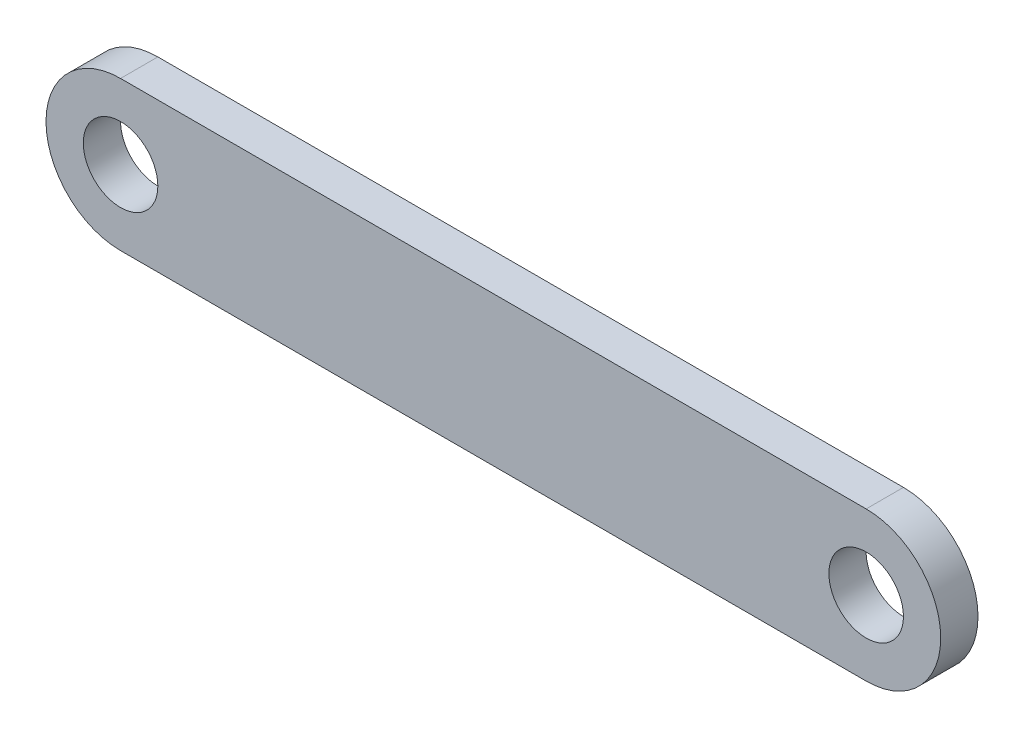
ISO-10303-21;
HEADER;
FILE_DESCRIPTION(('STEP AP214'),'2;1');
FILE_NAME('part.step','',(''),(''),'','','');
FILE_SCHEMA(('AUTOMOTIVE_DESIGN { 1 0 10303 214 1 1 1 1 }'));
ENDSEC;
DATA;
#1=APPLICATION_CONTEXT('core data for automotive mechanical design processes');
#2=APPLICATION_PROTOCOL_DEFINITION('international standard','automotive_design',2000,#1);
#3=PRODUCT_CONTEXT('',#1,'mechanical');
#4=PRODUCT('Part','Part','',(#3));
#5=PRODUCT_RELATED_PRODUCT_CATEGORY('part','',(#4));
#6=PRODUCT_DEFINITION_FORMATION('','',#4);
#7=PRODUCT_DEFINITION_CONTEXT('part definition',#1,'design');
#8=PRODUCT_DEFINITION('design','',#6,#7);
#9=PRODUCT_DEFINITION_SHAPE('','',#8);
#10=(LENGTH_UNIT() NAMED_UNIT(*) SI_UNIT(.MILLI.,.METRE.));
#11=(NAMED_UNIT(*) PLANE_ANGLE_UNIT() SI_UNIT($,.RADIAN.));
#12=(NAMED_UNIT(*) SI_UNIT($,.STERADIAN.) SOLID_ANGLE_UNIT());
#13=UNCERTAINTY_MEASURE_WITH_UNIT(LENGTH_MEASURE(1.E-05),#10,'distance_accuracy_value','');
#14=(GEOMETRIC_REPRESENTATION_CONTEXT(3) GLOBAL_UNCERTAINTY_ASSIGNED_CONTEXT((#13)) GLOBAL_UNIT_ASSIGNED_CONTEXT((#10,
#11,#12)) REPRESENTATION_CONTEXT('',''));
#15=CARTESIAN_POINT('',(0.,0.,0.));
#16=DIRECTION('',(0.,0.,1.));
#17=DIRECTION('',(1.,0.,0.));
#18=AXIS2_PLACEMENT_3D('',#15,#16,#17);
#19=CARTESIAN_POINT('',(0.,0.,-2.5));
#20=DIRECTION('',(0.,0.,1.));
#21=DIRECTION('',(1.,0.,0.));
#22=AXIS2_PLACEMENT_3D('',#19,#20,#21);
#23=CYLINDRICAL_SURFACE('',#22,10.);
#24=DIRECTION('',(0.,0.,1.));
#25=VECTOR('',#24,1.);
#26=CARTESIAN_POINT('',(0.,-10.,-2.5));
#27=LINE('',#26,#25);
#28=CARTESIAN_POINT('',(0.,-10.,-2.5));
#29=VERTEX_POINT('',#28);
#30=CARTESIAN_POINT('',(0.,-10.,2.5));
#31=VERTEX_POINT('',#30);
#32=EDGE_CURVE('E48',#29,#31,#27,.T.);
#33=ORIENTED_EDGE('',*,*,#32,.T.);
#34=CARTESIAN_POINT('',(0.,0.,2.5));
#35=DIRECTION('',(0.,0.,1.));
#36=DIRECTION('',(1.,0.,0.));
#37=AXIS2_PLACEMENT_3D('',#34,#35,#36);
#38=CIRCLE('',#37,10.);
#39=CARTESIAN_POINT('',(0.,10.,2.5));
#40=VERTEX_POINT('',#39);
#41=EDGE_CURVE('E86',#40,#31,#38,.T.);
#42=ORIENTED_EDGE('',*,*,#41,.F.);
#43=DIRECTION('',(0.,0.,1.));
#44=VECTOR('',#43,1.);
#45=CARTESIAN_POINT('',(0.,10.,-2.5));
#46=LINE('',#45,#44);
#47=CARTESIAN_POINT('',(0.,10.,-2.5));
#48=VERTEX_POINT('',#47);
#49=EDGE_CURVE('E11',#48,#40,#46,.T.);
#50=ORIENTED_EDGE('',*,*,#49,.F.);
#51=CARTESIAN_POINT('',(0.,0.,-2.5));
#52=DIRECTION('',(0.,0.,1.));
#53=DIRECTION('',(1.,0.,0.));
#54=AXIS2_PLACEMENT_3D('',#51,#52,#53);
#55=CIRCLE('',#54,10.);
#56=EDGE_CURVE('E87',#48,#29,#55,.T.);
#57=ORIENTED_EDGE('',*,*,#56,.T.);
#58=EDGE_LOOP('',(#33,#42,#50,#57));
#59=FACE_BOUND('',#58,.T.);
#60=ADVANCED_FACE('F45',(#59),#23,.T.);
#61=CARTESIAN_POINT('',(0.,10.,-2.5));
#62=DIRECTION('',(0.,1.,0.));
#63=DIRECTION('',(0.,0.,1.));
#64=AXIS2_PLACEMENT_3D('',#61,#62,#63);
#65=PLANE('',#64);
#66=ORIENTED_EDGE('',*,*,#49,.T.);
#67=DIRECTION('',(-1.,0.,0.));
#68=VECTOR('',#67,1.);
#69=CARTESIAN_POINT('',(0.,10.,2.5));
#70=LINE('',#69,#68);
#71=CARTESIAN_POINT('',(100.,10.,2.5));
#72=VERTEX_POINT('',#71);
#73=EDGE_CURVE('E106',#72,#40,#70,.T.);
#74=ORIENTED_EDGE('',*,*,#73,.F.);
#75=DIRECTION('',(0.,0.,1.));
#76=VECTOR('',#75,1.);
#77=CARTESIAN_POINT('',(100.,10.,-2.5));
#78=LINE('',#77,#76);
#79=CARTESIAN_POINT('',(100.,10.,-2.5));
#80=VERTEX_POINT('',#79);
#81=EDGE_CURVE('E54',#80,#72,#78,.T.);
#82=ORIENTED_EDGE('',*,*,#81,.F.);
#83=DIRECTION('',(-1.,0.,0.));
#84=VECTOR('',#83,1.);
#85=CARTESIAN_POINT('',(0.,10.,-2.5));
#86=LINE('',#85,#84);
#87=EDGE_CURVE('E93',#80,#48,#86,.T.);
#88=ORIENTED_EDGE('',*,*,#87,.T.);
#89=EDGE_LOOP('',(#66,#74,#82,#88));
#90=FACE_BOUND('',#89,.T.);
#91=ADVANCED_FACE('F144',(#90),#65,.T.);
#92=CARTESIAN_POINT('',(100.,0.,-2.5));
#93=DIRECTION('',(0.,0.,1.));
#94=DIRECTION('',(1.,0.,0.));
#95=AXIS2_PLACEMENT_3D('',#92,#93,#94);
#96=CYLINDRICAL_SURFACE('',#95,10.);
#97=ORIENTED_EDGE('',*,*,#81,.T.);
#98=CARTESIAN_POINT('',(100.,0.,2.5));
#99=DIRECTION('',(0.,0.,1.));
#100=DIRECTION('',(-1.,0.,0.));
#101=AXIS2_PLACEMENT_3D('',#98,#99,#100);
#102=CIRCLE('',#101,10.);
#103=CARTESIAN_POINT('',(100.,-10.,2.5));
#104=VERTEX_POINT('',#103);
#105=EDGE_CURVE('E101',#104,#72,#102,.T.);
#106=ORIENTED_EDGE('',*,*,#105,.F.);
#107=DIRECTION('',(0.,0.,1.));
#108=VECTOR('',#107,1.);
#109=CARTESIAN_POINT('',(100.,-10.,-2.5));
#110=LINE('',#109,#108);
#111=CARTESIAN_POINT('',(100.,-10.,-2.5));
#112=VERTEX_POINT('',#111);
#113=EDGE_CURVE('E92',#112,#104,#110,.T.);
#114=ORIENTED_EDGE('',*,*,#113,.F.);
#115=CARTESIAN_POINT('',(100.,0.,-2.5));
#116=DIRECTION('',(0.,0.,1.));
#117=DIRECTION('',(-1.,0.,0.));
#118=AXIS2_PLACEMENT_3D('',#115,#116,#117);
#119=CIRCLE('',#118,10.);
#120=EDGE_CURVE('E133',#112,#80,#119,.T.);
#121=ORIENTED_EDGE('',*,*,#120,.T.);
#122=EDGE_LOOP('',(#97,#106,#114,#121));
#123=FACE_BOUND('',#122,.T.);
#124=ADVANCED_FACE('F141',(#123),#96,.T.);
#125=CARTESIAN_POINT('',(0.,-10.,-2.5));
#126=DIRECTION('',(0.,-1.,0.));
#127=DIRECTION('',(0.,0.,-1.));
#128=AXIS2_PLACEMENT_3D('',#125,#126,#127);
#129=PLANE('',#128);
#130=ORIENTED_EDGE('',*,*,#113,.T.);
#131=DIRECTION('',(1.,0.,0.));
#132=VECTOR('',#131,1.);
#133=CARTESIAN_POINT('',(0.,-10.,2.5));
#134=LINE('',#133,#132);
#135=EDGE_CURVE('E95',#31,#104,#134,.T.);
#136=ORIENTED_EDGE('',*,*,#135,.F.);
#137=ORIENTED_EDGE('',*,*,#32,.F.);
#138=DIRECTION('',(1.,0.,0.));
#139=VECTOR('',#138,1.);
#140=CARTESIAN_POINT('',(0.,-10.,-2.5));
#141=LINE('',#140,#139);
#142=EDGE_CURVE('E130',#29,#112,#141,.T.);
#143=ORIENTED_EDGE('',*,*,#142,.T.);
#144=EDGE_LOOP('',(#130,#136,#137,#143));
#145=FACE_BOUND('',#144,.T.);
#146=ADVANCED_FACE('F96',(#145),#129,.T.);
#147=CARTESIAN_POINT('',(0.,0.,-2.5));
#148=DIRECTION('',(0.,0.,1.));
#149=DIRECTION('',(1.,0.,0.));
#150=AXIS2_PLACEMENT_3D('',#147,#148,#149);
#151=PLANE('',#150);
#152=CARTESIAN_POINT('',(0.,0.,-2.5));
#153=DIRECTION('',(0.,0.,1.));
#154=DIRECTION('',(1.,0.,0.));
#155=AXIS2_PLACEMENT_3D('',#152,#153,#154);
#156=CIRCLE('',#155,5.);
#157=CARTESIAN_POINT('',(5.,0.,-2.5));
#158=VERTEX_POINT('',#157);
#159=EDGE_CURVE('E120',#158,#158,#156,.T.);
#160=ORIENTED_EDGE('',*,*,#159,.T.);
#161=EDGE_LOOP('',(#160));
#162=FACE_BOUND('',#161,.T.);
#163=CARTESIAN_POINT('',(100.,0.,-2.5));
#164=DIRECTION('',(0.,0.,1.));
#165=DIRECTION('',(1.,0.,0.));
#166=AXIS2_PLACEMENT_3D('',#163,#164,#165);
#167=CIRCLE('',#166,5.);
#168=CARTESIAN_POINT('',(105.,0.,-2.5));
#169=VERTEX_POINT('',#168);
#170=EDGE_CURVE('E124',#169,#169,#167,.T.);
#171=ORIENTED_EDGE('',*,*,#170,.T.);
#172=EDGE_LOOP('',(#171));
#173=FACE_BOUND('',#172,.T.);
#174=ORIENTED_EDGE('',*,*,#56,.F.);
#175=ORIENTED_EDGE('',*,*,#87,.F.);
#176=ORIENTED_EDGE('',*,*,#120,.F.);
#177=ORIENTED_EDGE('',*,*,#142,.F.);
#178=EDGE_LOOP('',(#174,#175,#176,#177));
#179=FACE_BOUND('',#178,.T.);
#180=ADVANCED_FACE('F146',(#162,#173,#179),#151,.F.);
#181=CARTESIAN_POINT('',(100.,0.,-2.5));
#182=DIRECTION('',(0.,0.,1.));
#183=DIRECTION('',(1.,0.,0.));
#184=AXIS2_PLACEMENT_3D('',#181,#182,#183);
#185=CYLINDRICAL_SURFACE('',#184,5.);
#186=ORIENTED_EDGE('',*,*,#170,.F.);
#187=EDGE_LOOP('',(#186));
#188=FACE_BOUND('',#187,.T.);
#189=CARTESIAN_POINT('',(100.,0.,2.5));
#190=DIRECTION('',(0.,0.,1.));
#191=DIRECTION('',(1.,0.,0.));
#192=AXIS2_PLACEMENT_3D('',#189,#190,#191);
#193=CIRCLE('',#192,5.);
#194=CARTESIAN_POINT('',(105.,0.,2.5));
#195=VERTEX_POINT('',#194);
#196=EDGE_CURVE('E108',#195,#195,#193,.T.);
#197=ORIENTED_EDGE('',*,*,#196,.T.);
#198=EDGE_LOOP('',(#197));
#199=FACE_BOUND('',#198,.T.);
#200=ADVANCED_FACE('F148',(#188,#199),#185,.F.);
#201=CARTESIAN_POINT('',(0.,0.,-2.5));
#202=DIRECTION('',(0.,0.,1.));
#203=DIRECTION('',(1.,0.,0.));
#204=AXIS2_PLACEMENT_3D('',#201,#202,#203);
#205=CYLINDRICAL_SURFACE('',#204,5.);
#206=ORIENTED_EDGE('',*,*,#159,.F.);
#207=EDGE_LOOP('',(#206));
#208=FACE_BOUND('',#207,.T.);
#209=CARTESIAN_POINT('',(0.,0.,2.5));
#210=DIRECTION('',(0.,0.,1.));
#211=DIRECTION('',(1.,0.,0.));
#212=AXIS2_PLACEMENT_3D('',#209,#210,#211);
#213=CIRCLE('',#212,5.);
#214=CARTESIAN_POINT('',(5.,0.,2.5));
#215=VERTEX_POINT('',#214);
#216=EDGE_CURVE('E112',#215,#215,#213,.T.);
#217=ORIENTED_EDGE('',*,*,#216,.T.);
#218=EDGE_LOOP('',(#217));
#219=FACE_BOUND('',#218,.T.);
#220=ADVANCED_FACE('F155',(#208,#219),#205,.F.);
#221=CARTESIAN_POINT('',(0.,0.,2.5));
#222=DIRECTION('',(0.,0.,1.));
#223=DIRECTION('',(1.,0.,0.));
#224=AXIS2_PLACEMENT_3D('',#221,#222,#223);
#225=PLANE('',#224);
#226=ORIENTED_EDGE('',*,*,#196,.F.);
#227=EDGE_LOOP('',(#226));
#228=FACE_BOUND('',#227,.T.);
#229=ORIENTED_EDGE('',*,*,#41,.T.);
#230=ORIENTED_EDGE('',*,*,#135,.T.);
#231=ORIENTED_EDGE('',*,*,#105,.T.);
#232=ORIENTED_EDGE('',*,*,#73,.T.);
#233=EDGE_LOOP('',(#229,#230,#231,#232));
#234=FACE_BOUND('',#233,.T.);
#235=ORIENTED_EDGE('',*,*,#216,.F.);
#236=EDGE_LOOP('',(#235));
#237=FACE_BOUND('',#236,.T.);
#238=ADVANCED_FACE('F104',(#228,#234,#237),#225,.T.);
#239=CLOSED_SHELL('',(#60,#91,#124,#146,#180,#200,#220,#238));
#240=MANIFOLD_SOLID_BREP('B2',#239);
#241=ADVANCED_BREP_SHAPE_REPRESENTATION('',(#18,#240),#14);
#242=SHAPE_DEFINITION_REPRESENTATION(#9,#241);
ENDSEC;
END-ISO-10303-21;
